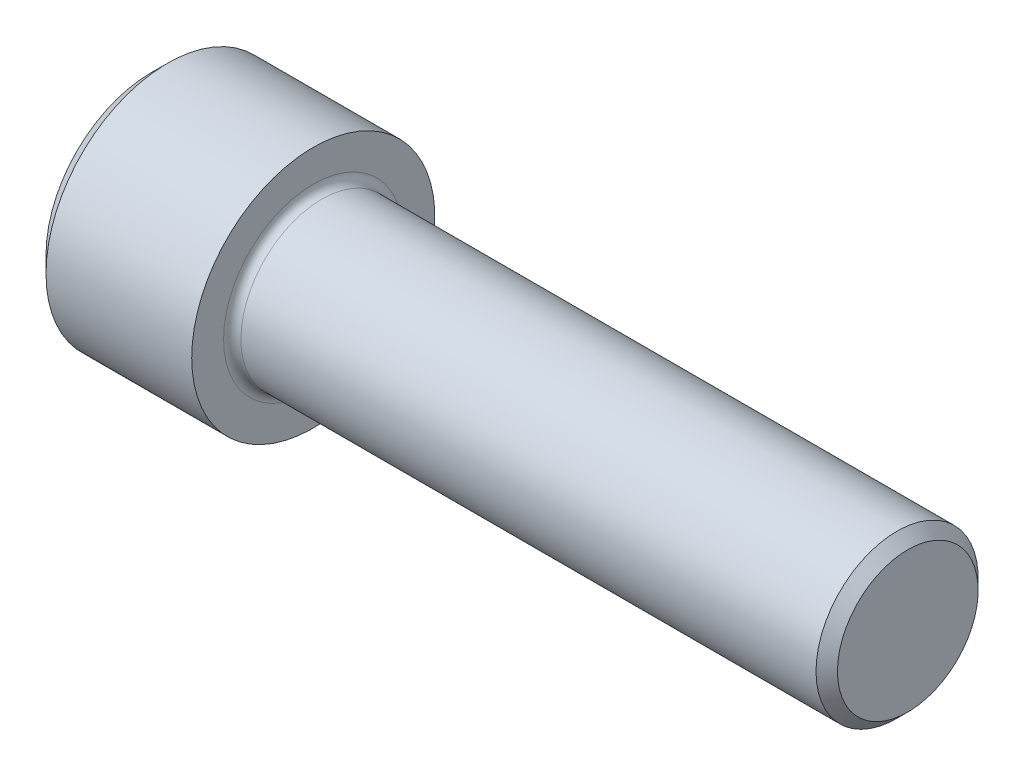
ISO-10303-21;
HEADER;
FILE_DESCRIPTION(('STEP AP214'),'2;1');
FILE_NAME('part.step','',(''),(''),'','','');
FILE_SCHEMA(('AUTOMOTIVE_DESIGN { 1 0 10303 214 1 1 1 1 }'));
ENDSEC;
DATA;
#1=APPLICATION_CONTEXT('core data for automotive mechanical design processes');
#2=APPLICATION_PROTOCOL_DEFINITION('international standard','automotive_design',2000,#1);
#3=PRODUCT_CONTEXT('',#1,'mechanical');
#4=PRODUCT('Part','Part','',(#3));
#5=PRODUCT_RELATED_PRODUCT_CATEGORY('part','',(#4));
#6=PRODUCT_DEFINITION_FORMATION('','',#4);
#7=PRODUCT_DEFINITION_CONTEXT('part definition',#1,'design');
#8=PRODUCT_DEFINITION('design','',#6,#7);
#9=PRODUCT_DEFINITION_SHAPE('','',#8);
#10=(LENGTH_UNIT() NAMED_UNIT(*) SI_UNIT(.MILLI.,.METRE.));
#11=(NAMED_UNIT(*) PLANE_ANGLE_UNIT() SI_UNIT($,.RADIAN.));
#12=(NAMED_UNIT(*) SI_UNIT($,.STERADIAN.) SOLID_ANGLE_UNIT());
#13=UNCERTAINTY_MEASURE_WITH_UNIT(LENGTH_MEASURE(1.E-05),#10,'distance_accuracy_value','');
#14=(GEOMETRIC_REPRESENTATION_CONTEXT(3) GLOBAL_UNCERTAINTY_ASSIGNED_CONTEXT((#13)) GLOBAL_UNIT_ASSIGNED_CONTEXT((#10,
#11,#12)) REPRESENTATION_CONTEXT('',''));
#15=CARTESIAN_POINT('',(0.,0.,0.));
#16=DIRECTION('',(0.,0.,1.));
#17=DIRECTION('',(1.,0.,0.));
#18=AXIS2_PLACEMENT_3D('',#15,#16,#17);
#19=CARTESIAN_POINT('',(0.,0.,0.));
#20=DIRECTION('',(-1.,0.,0.));
#21=DIRECTION('',(0.,0.,1.));
#22=AXIS2_PLACEMENT_3D('',#19,#20,#21);
#23=PLANE('',#22);
#24=DIRECTION('',(0.,-0.499999999999999,0.866025403784439));
#25=VECTOR('',#24,1.);
#26=CARTESIAN_POINT('',(0.,4.58271776169266,0.));
#27=LINE('',#26,#25);
#28=CARTESIAN_POINT('',(0.,4.58271776169266,0.));
#29=VERTEX_POINT('',#28);
#30=CARTESIAN_POINT('',(0.,2.29135888084634,3.96874999999999));
#31=VERTEX_POINT('',#30);
#32=EDGE_CURVE('E266',#29,#31,#27,.T.);
#33=ORIENTED_EDGE('',*,*,#32,.T.);
#34=DIRECTION('',(0.,1.,0.));
#35=VECTOR('',#34,1.);
#36=CARTESIAN_POINT('',(0.,-2.29135888084632,3.96875));
#37=LINE('',#36,#35);
#38=CARTESIAN_POINT('',(0.,-2.29135888084632,3.96875));
#39=VERTEX_POINT('',#38);
#40=EDGE_CURVE('E126',#39,#31,#37,.T.);
#41=ORIENTED_EDGE('',*,*,#40,.F.);
#42=DIRECTION('',(0.,-0.500000000000001,-0.866025403784438));
#43=VECTOR('',#42,1.);
#44=CARTESIAN_POINT('',(0.,-2.29135888084632,3.96875));
#45=LINE('',#44,#43);
#46=CARTESIAN_POINT('',(0.,-4.58271776169265,0.));
#47=VERTEX_POINT('',#46);
#48=EDGE_CURVE('E269',#39,#47,#45,.T.);
#49=ORIENTED_EDGE('',*,*,#48,.T.);
#50=DIRECTION('',(0.,0.499999999999998,-0.86602540378444));
#51=VECTOR('',#50,1.);
#52=CARTESIAN_POINT('',(0.,-4.58271776169265,0.));
#53=LINE('',#52,#51);
#54=CARTESIAN_POINT('',(0.,-2.29135888084633,-3.96875));
#55=VERTEX_POINT('',#54);
#56=EDGE_CURVE('E272',#47,#55,#53,.T.);
#57=ORIENTED_EDGE('',*,*,#56,.T.);
#58=DIRECTION('',(0.,-1.,0.));
#59=VECTOR('',#58,1.);
#60=CARTESIAN_POINT('',(0.,2.29135888084633,-3.96875));
#61=LINE('',#60,#59);
#62=CARTESIAN_POINT('',(0.,2.29135888084633,-3.96875));
#63=VERTEX_POINT('',#62);
#64=EDGE_CURVE('E275',#63,#55,#61,.T.);
#65=ORIENTED_EDGE('',*,*,#64,.F.);
#66=DIRECTION('',(0.,-0.500000000000001,-0.866025403784438));
#67=VECTOR('',#66,1.);
#68=CARTESIAN_POINT('',(0.,4.58271776169266,0.));
#69=LINE('',#68,#67);
#70=EDGE_CURVE('E121',#29,#63,#69,.T.);
#71=ORIENTED_EDGE('',*,*,#70,.F.);
#72=EDGE_LOOP('',(#33,#41,#49,#57,#65,#71));
#73=FACE_BOUND('',#72,.T.);
#74=CARTESIAN_POINT('',(0.,0.,0.));
#75=DIRECTION('',(-1.,0.,0.));
#76=DIRECTION('',(0.,0.,1.));
#77=AXIS2_PLACEMENT_3D('',#74,#75,#76);
#78=CIRCLE('',#77,6.17855);
#79=CARTESIAN_POINT('',(0.,0.,6.17855));
#80=VERTEX_POINT('',#79);
#81=EDGE_CURVE('E150',#80,#80,#78,.T.);
#82=ORIENTED_EDGE('',*,*,#81,.T.);
#83=EDGE_LOOP('',(#82));
#84=FACE_BOUND('',#83,.T.);
#85=ADVANCED_FACE('F34',(#73,#84),#23,.T.);
#86=CARTESIAN_POINT('',(0.,0.,0.));
#87=DIRECTION('',(1.,0.,0.));
#88=DIRECTION('',(0.,0.,-1.));
#89=AXIS2_PLACEMENT_3D('',#86,#87,#88);
#90=CONICAL_SURFACE('',#89,6.17855,0.785398163397447);
#91=CARTESIAN_POINT('',(0.965199999999999,0.,0.));
#92=DIRECTION('',(-1.,0.,0.));
#93=DIRECTION('',(0.,0.,1.));
#94=AXIS2_PLACEMENT_3D('',#91,#92,#93);
#95=CIRCLE('',#94,7.14375);
#96=CARTESIAN_POINT('',(0.965199999999999,0.,7.14375));
#97=VERTEX_POINT('',#96);
#98=EDGE_CURVE('E147',#97,#97,#95,.T.);
#99=ORIENTED_EDGE('',*,*,#98,.T.);
#100=EDGE_LOOP('',(#99));
#101=FACE_BOUND('',#100,.T.);
#102=ORIENTED_EDGE('',*,*,#81,.F.);
#103=EDGE_LOOP('',(#102));
#104=FACE_BOUND('',#103,.T.);
#105=ADVANCED_FACE('F171',(#101,#104),#90,.T.);
#106=CARTESIAN_POINT('',(-31.75,0.,0.));
#107=DIRECTION('',(-1.,0.,0.));
#108=DIRECTION('',(0.,0.,1.));
#109=AXIS2_PLACEMENT_3D('',#106,#107,#108);
#110=CYLINDRICAL_SURFACE('',#109,7.14375);
#111=CARTESIAN_POINT('',(9.525,0.,0.));
#112=DIRECTION('',(-1.,0.,0.));
#113=DIRECTION('',(0.,0.,1.));
#114=AXIS2_PLACEMENT_3D('',#111,#112,#113);
#115=CIRCLE('',#114,7.14375);
#116=CARTESIAN_POINT('',(9.525,0.,7.14375));
#117=VERTEX_POINT('',#116);
#118=EDGE_CURVE('E144',#117,#117,#115,.T.);
#119=ORIENTED_EDGE('',*,*,#118,.T.);
#120=EDGE_LOOP('',(#119));
#121=FACE_BOUND('',#120,.T.);
#122=ORIENTED_EDGE('',*,*,#98,.F.);
#123=EDGE_LOOP('',(#122));
#124=FACE_BOUND('',#123,.T.);
#125=ADVANCED_FACE('F176',(#121,#124),#110,.T.);
#126=CARTESIAN_POINT('',(9.525,7.14375,0.));
#127=DIRECTION('',(1.,0.,0.));
#128=DIRECTION('',(0.,0.,-1.));
#129=AXIS2_PLACEMENT_3D('',#126,#127,#128);
#130=PLANE('',#129);
#131=CARTESIAN_POINT('',(9.525,0.,0.));
#132=DIRECTION('',(1.,0.,0.));
#133=DIRECTION('',(0.,0.,-1.));
#134=AXIS2_PLACEMENT_3D('',#131,#132,#133);
#135=CIRCLE('',#134,5.27049999999996);
#136=CARTESIAN_POINT('',(9.525,0.,-5.27049999999996));
#137=VERTEX_POINT('',#136);
#138=EDGE_CURVE('E42',#137,#137,#135,.F.);
#139=ORIENTED_EDGE('',*,*,#138,.T.);
#140=EDGE_LOOP('',(#139));
#141=FACE_BOUND('',#140,.T.);
#142=ORIENTED_EDGE('',*,*,#118,.F.);
#143=EDGE_LOOP('',(#142));
#144=FACE_BOUND('',#143,.T.);
#145=ADVANCED_FACE('F155',(#141,#144),#130,.T.);
#146=CARTESIAN_POINT('',(-31.75,0.,0.));
#147=DIRECTION('',(-1.,0.,0.));
#148=DIRECTION('',(0.,0.,1.));
#149=AXIS2_PLACEMENT_3D('',#146,#147,#148);
#150=CYLINDRICAL_SURFACE('',#149,4.76249999999996);
#151=CARTESIAN_POINT('',(10.033,0.,0.));
#152=DIRECTION('',(1.,0.,0.));
#153=DIRECTION('',(0.,0.,-1.));
#154=AXIS2_PLACEMENT_3D('',#151,#152,#153);
#155=CIRCLE('',#154,4.76249999999996);
#156=CARTESIAN_POINT('',(10.033,0.,-4.76249999999996));
#157=VERTEX_POINT('',#156);
#158=EDGE_CURVE('E11',#157,#157,#155,.T.);
#159=ORIENTED_EDGE('',*,*,#158,.T.);
#160=EDGE_LOOP('',(#159));
#161=FACE_BOUND('',#160,.T.);
#162=CARTESIAN_POINT('',(43.8200799999999,0.,0.));
#163=DIRECTION('',(-1.,0.,0.));
#164=DIRECTION('',(0.,0.,1.));
#165=AXIS2_PLACEMENT_3D('',#162,#163,#164);
#166=CIRCLE('',#165,4.76249999999992);
#167=CARTESIAN_POINT('',(43.8200799999999,0.,4.76249999999992));
#168=VERTEX_POINT('',#167);
#169=EDGE_CURVE('E141',#168,#168,#166,.T.);
#170=ORIENTED_EDGE('',*,*,#169,.T.);
#171=EDGE_LOOP('',(#170));
#172=FACE_BOUND('',#171,.T.);
#173=ADVANCED_FACE('F186',(#161,#172),#150,.T.);
#174=CARTESIAN_POINT('',(44.45,0.,0.));
#175=DIRECTION('',(-1.,0.,0.));
#176=DIRECTION('',(0.,0.,1.));
#177=AXIS2_PLACEMENT_3D('',#174,#175,#176);
#178=CONICAL_SURFACE('',#177,4.13258,0.785398163397337);
#179=ORIENTED_EDGE('',*,*,#169,.F.);
#180=EDGE_LOOP('',(#179));
#181=FACE_BOUND('',#180,.T.);
#182=CARTESIAN_POINT('',(44.45,0.,0.));
#183=DIRECTION('',(-1.,0.,0.));
#184=DIRECTION('',(0.,0.,1.));
#185=AXIS2_PLACEMENT_3D('',#182,#183,#184);
#186=CIRCLE('',#185,4.13258);
#187=CARTESIAN_POINT('',(44.45,0.,4.13258));
#188=VERTEX_POINT('',#187);
#189=EDGE_CURVE('E137',#188,#188,#186,.T.);
#190=ORIENTED_EDGE('',*,*,#189,.T.);
#191=EDGE_LOOP('',(#190));
#192=FACE_BOUND('',#191,.T.);
#193=ADVANCED_FACE('F166',(#181,#192),#178,.T.);
#194=CARTESIAN_POINT('',(44.45,4.13258,0.));
#195=DIRECTION('',(1.,0.,0.));
#196=DIRECTION('',(0.,0.,-1.));
#197=AXIS2_PLACEMENT_3D('',#194,#195,#196);
#198=PLANE('',#197);
#199=ORIENTED_EDGE('',*,*,#189,.F.);
#200=EDGE_LOOP('',(#199));
#201=FACE_BOUND('',#200,.T.);
#202=ADVANCED_FACE('F159',(#201),#198,.T.);
#203=CARTESIAN_POINT('',(10.033,0.,0.));
#204=DIRECTION('',(1.,0.,0.));
#205=DIRECTION('',(0.,0.,-1.));
#206=AXIS2_PLACEMENT_3D('',#203,#204,#205);
#207=TOROIDAL_SURFACE('',#206,5.27049999999996,0.508);
#208=ORIENTED_EDGE('',*,*,#158,.F.);
#209=EDGE_LOOP('',(#208));
#210=FACE_BOUND('',#209,.T.);
#211=ORIENTED_EDGE('',*,*,#138,.F.);
#212=EDGE_LOOP('',(#211));
#213=FACE_BOUND('',#212,.T.);
#214=ADVANCED_FACE('F36',(#210,#213),#207,.F.);
#215=CARTESIAN_POINT('',(4.6228,4.58271776169266,0.));
#216=DIRECTION('',(0.,-0.866025403784439,-0.499999999999999));
#217=DIRECTION('',(0.,0.499999999999999,-0.866025403784439));
#218=AXIS2_PLACEMENT_3D('',#215,#216,#217);
#219=PLANE('',#218);
#220=ORIENTED_EDGE('',*,*,#32,.F.);
#221=DIRECTION('',(-1.,0.,0.));
#222=VECTOR('',#221,1.);
#223=CARTESIAN_POINT('',(4.6228,4.58271776169266,0.));
#224=LINE('',#223,#222);
#225=CARTESIAN_POINT('',(4.6228,4.58271776169266,0.));
#226=VERTEX_POINT('',#225);
#227=EDGE_CURVE('E265',#226,#29,#224,.T.);
#228=ORIENTED_EDGE('',*,*,#227,.F.);
#229=DIRECTION('',(0.,-0.499999999999999,0.866025403784439));
#230=VECTOR('',#229,1.);
#231=CARTESIAN_POINT('',(4.6228,4.58271776169266,0.));
#232=LINE('',#231,#230);
#233=CARTESIAN_POINT('',(4.6228,3.43703832126949,1.984375));
#234=VERTEX_POINT('',#233);
#235=EDGE_CURVE('E49',#226,#234,#232,.T.);
#236=ORIENTED_EDGE('',*,*,#235,.T.);
#237=CARTESIAN_POINT('',(4.6228,2.29135888084634,3.96874999999999));
#238=VERTEX_POINT('',#237);
#239=EDGE_CURVE('E107',#234,#238,#232,.T.);
#240=ORIENTED_EDGE('',*,*,#239,.T.);
#241=DIRECTION('',(-1.,0.,0.));
#242=VECTOR('',#241,1.);
#243=CARTESIAN_POINT('',(4.6228,2.29135888084634,3.96874999999999));
#244=LINE('',#243,#242);
#245=EDGE_CURVE('E119',#238,#31,#244,.T.);
#246=ORIENTED_EDGE('',*,*,#245,.T.);
#247=EDGE_LOOP('',(#220,#228,#236,#240,#246));
#248=FACE_BOUND('',#247,.T.);
#249=ADVANCED_FACE('F118',(#248),#219,.T.);
#250=CARTESIAN_POINT('',(4.6228,-2.29135888084632,3.96875));
#251=DIRECTION('',(0.,0.,1.));
#252=DIRECTION('',(0.,-1.,0.));
#253=AXIS2_PLACEMENT_3D('',#250,#251,#252);
#254=PLANE('',#253);
#255=ORIENTED_EDGE('',*,*,#40,.T.);
#256=ORIENTED_EDGE('',*,*,#245,.F.);
#257=DIRECTION('',(0.,1.,0.));
#258=VECTOR('',#257,1.);
#259=CARTESIAN_POINT('',(4.6228,-2.29135888084632,3.96875));
#260=LINE('',#259,#258);
#261=CARTESIAN_POINT('',(4.6228,0.,3.96875));
#262=VERTEX_POINT('',#261);
#263=EDGE_CURVE('E105',#262,#238,#260,.T.);
#264=ORIENTED_EDGE('',*,*,#263,.F.);
#265=CARTESIAN_POINT('',(4.6228,-2.29135888084632,3.96875));
#266=VERTEX_POINT('',#265);
#267=EDGE_CURVE('E115',#266,#262,#260,.T.);
#268=ORIENTED_EDGE('',*,*,#267,.F.);
#269=DIRECTION('',(-1.,0.,0.));
#270=VECTOR('',#269,1.);
#271=CARTESIAN_POINT('',(4.6228,-2.29135888084632,3.96875));
#272=LINE('',#271,#270);
#273=EDGE_CURVE('E128',#266,#39,#272,.T.);
#274=ORIENTED_EDGE('',*,*,#273,.T.);
#275=EDGE_LOOP('',(#255,#256,#264,#268,#274));
#276=FACE_BOUND('',#275,.T.);
#277=ADVANCED_FACE('F123',(#276),#254,.F.);
#278=CARTESIAN_POINT('',(4.6228,-2.29135888084632,3.96875));
#279=DIRECTION('',(0.,0.866025403784438,-0.500000000000001));
#280=DIRECTION('',(0.,0.500000000000001,0.866025403784438));
#281=AXIS2_PLACEMENT_3D('',#278,#279,#280);
#282=PLANE('',#281);
#283=ORIENTED_EDGE('',*,*,#48,.F.);
#284=ORIENTED_EDGE('',*,*,#273,.F.);
#285=DIRECTION('',(0.,-0.500000000000001,-0.866025403784438));
#286=VECTOR('',#285,1.);
#287=CARTESIAN_POINT('',(4.6228,-2.29135888084632,3.96875));
#288=LINE('',#287,#286);
#289=CARTESIAN_POINT('',(4.6228,-3.43703832126948,1.984375));
#290=VERTEX_POINT('',#289);
#291=EDGE_CURVE('E246',#266,#290,#288,.T.);
#292=ORIENTED_EDGE('',*,*,#291,.T.);
#293=CARTESIAN_POINT('',(4.6228,-4.58271776169265,0.));
#294=VERTEX_POINT('',#293);
#295=EDGE_CURVE('E248',#290,#294,#288,.T.);
#296=ORIENTED_EDGE('',*,*,#295,.T.);
#297=DIRECTION('',(-1.,0.,0.));
#298=VECTOR('',#297,1.);
#299=CARTESIAN_POINT('',(4.6228,-4.58271776169265,0.));
#300=LINE('',#299,#298);
#301=EDGE_CURVE('E133',#294,#47,#300,.T.);
#302=ORIENTED_EDGE('',*,*,#301,.T.);
#303=EDGE_LOOP('',(#283,#284,#292,#296,#302));
#304=FACE_BOUND('',#303,.T.);
#305=ADVANCED_FACE('F198',(#304),#282,.T.);
#306=CARTESIAN_POINT('',(4.6228,-4.58271776169265,0.));
#307=DIRECTION('',(0.,0.86602540378444,0.499999999999998));
#308=DIRECTION('',(0.,-0.499999999999998,0.86602540378444));
#309=AXIS2_PLACEMENT_3D('',#306,#307,#308);
#310=PLANE('',#309);
#311=ORIENTED_EDGE('',*,*,#56,.F.);
#312=ORIENTED_EDGE('',*,*,#301,.F.);
#313=DIRECTION('',(0.,0.499999999999998,-0.86602540378444));
#314=VECTOR('',#313,1.);
#315=CARTESIAN_POINT('',(4.6228,-4.58271776169265,0.));
#316=LINE('',#315,#314);
#317=CARTESIAN_POINT('',(4.6228,-3.43703832126949,-1.98437499999999));
#318=VERTEX_POINT('',#317);
#319=EDGE_CURVE('E251',#294,#318,#316,.T.);
#320=ORIENTED_EDGE('',*,*,#319,.T.);
#321=CARTESIAN_POINT('',(4.6228,-2.29135888084633,-3.96875));
#322=VERTEX_POINT('',#321);
#323=EDGE_CURVE('E255',#318,#322,#316,.T.);
#324=ORIENTED_EDGE('',*,*,#323,.T.);
#325=DIRECTION('',(-1.,0.,0.));
#326=VECTOR('',#325,1.);
#327=CARTESIAN_POINT('',(4.6228,-2.29135888084633,-3.96875));
#328=LINE('',#327,#326);
#329=EDGE_CURVE('E284',#322,#55,#328,.T.);
#330=ORIENTED_EDGE('',*,*,#329,.T.);
#331=EDGE_LOOP('',(#311,#312,#320,#324,#330));
#332=FACE_BOUND('',#331,.T.);
#333=ADVANCED_FACE('F201',(#332),#310,.T.);
#334=CARTESIAN_POINT('',(4.6228,2.29135888084633,-3.96875));
#335=DIRECTION('',(0.,0.,-1.));
#336=DIRECTION('',(0.,1.,0.));
#337=AXIS2_PLACEMENT_3D('',#334,#335,#336);
#338=PLANE('',#337);
#339=ORIENTED_EDGE('',*,*,#64,.T.);
#340=ORIENTED_EDGE('',*,*,#329,.F.);
#341=DIRECTION('',(0.,-1.,0.));
#342=VECTOR('',#341,1.);
#343=CARTESIAN_POINT('',(4.6228,2.29135888084633,-3.96875));
#344=LINE('',#343,#342);
#345=CARTESIAN_POINT('',(4.6228,0.,-3.96875));
#346=VERTEX_POINT('',#345);
#347=EDGE_CURVE('E259',#346,#322,#344,.T.);
#348=ORIENTED_EDGE('',*,*,#347,.F.);
#349=CARTESIAN_POINT('',(4.6228,2.29135888084633,-3.96875));
#350=VERTEX_POINT('',#349);
#351=EDGE_CURVE('E260',#350,#346,#344,.T.);
#352=ORIENTED_EDGE('',*,*,#351,.F.);
#353=DIRECTION('',(-1.,0.,0.));
#354=VECTOR('',#353,1.);
#355=CARTESIAN_POINT('',(4.6228,2.29135888084633,-3.96875));
#356=LINE('',#355,#354);
#357=EDGE_CURVE('E281',#350,#63,#356,.T.);
#358=ORIENTED_EDGE('',*,*,#357,.T.);
#359=EDGE_LOOP('',(#339,#340,#348,#352,#358));
#360=FACE_BOUND('',#359,.T.);
#361=ADVANCED_FACE('F205',(#360),#338,.F.);
#362=CARTESIAN_POINT('',(4.6228,4.58271776169266,0.));
#363=DIRECTION('',(0.,0.866025403784438,-0.500000000000001));
#364=DIRECTION('',(0.,0.500000000000001,0.866025403784438));
#365=AXIS2_PLACEMENT_3D('',#362,#363,#364);
#366=PLANE('',#365);
#367=ORIENTED_EDGE('',*,*,#70,.T.);
#368=ORIENTED_EDGE('',*,*,#357,.F.);
#369=DIRECTION('',(0.,-0.500000000000001,-0.866025403784438));
#370=VECTOR('',#369,1.);
#371=CARTESIAN_POINT('',(4.6228,4.58271776169266,0.));
#372=LINE('',#371,#370);
#373=CARTESIAN_POINT('',(4.6228,3.43703832126949,-1.98437500000001));
#374=VERTEX_POINT('',#373);
#375=EDGE_CURVE('E263',#374,#350,#372,.T.);
#376=ORIENTED_EDGE('',*,*,#375,.F.);
#377=EDGE_CURVE('E237',#226,#374,#372,.T.);
#378=ORIENTED_EDGE('',*,*,#377,.F.);
#379=ORIENTED_EDGE('',*,*,#227,.T.);
#380=EDGE_LOOP('',(#367,#368,#376,#378,#379));
#381=FACE_BOUND('',#380,.T.);
#382=ADVANCED_FACE('F209',(#381),#366,.F.);
#383=CARTESIAN_POINT('',(4.6228,2.29135888084634,3.96874999999999));
#384=DIRECTION('',(-1.,0.,0.));
#385=DIRECTION('',(0.,0.,1.));
#386=AXIS2_PLACEMENT_3D('',#383,#384,#385);
#387=PLANE('',#386);
#388=CARTESIAN_POINT('',(4.6228,0.,0.));
#389=DIRECTION('',(-1.,0.,0.));
#390=DIRECTION('',(0.,0.,1.));
#391=AXIS2_PLACEMENT_3D('',#388,#389,#390);
#392=CIRCLE('',#391,3.96875);
#393=EDGE_CURVE('E127',#290,#262,#392,.T.);
#394=ORIENTED_EDGE('',*,*,#393,.F.);
#395=ORIENTED_EDGE('',*,*,#291,.F.);
#396=ORIENTED_EDGE('',*,*,#267,.T.);
#397=EDGE_LOOP('',(#394,#395,#396));
#398=FACE_BOUND('',#397,.T.);
#399=ADVANCED_FACE('F213',(#398),#387,.T.);
#400=EDGE_CURVE('E131',#318,#290,#392,.T.);
#401=ORIENTED_EDGE('',*,*,#400,.F.);
#402=ORIENTED_EDGE('',*,*,#319,.F.);
#403=ORIENTED_EDGE('',*,*,#295,.F.);
#404=EDGE_LOOP('',(#401,#402,#403));
#405=FACE_BOUND('',#404,.T.);
#406=ADVANCED_FACE('F216',(#405),#387,.T.);
#407=EDGE_CURVE('E290',#346,#318,#392,.T.);
#408=ORIENTED_EDGE('',*,*,#407,.F.);
#409=ORIENTED_EDGE('',*,*,#347,.T.);
#410=ORIENTED_EDGE('',*,*,#323,.F.);
#411=EDGE_LOOP('',(#408,#409,#410));
#412=FACE_BOUND('',#411,.T.);
#413=ADVANCED_FACE('F221',(#412),#387,.T.);
#414=EDGE_CURVE('E240',#374,#346,#392,.T.);
#415=ORIENTED_EDGE('',*,*,#414,.F.);
#416=ORIENTED_EDGE('',*,*,#375,.T.);
#417=ORIENTED_EDGE('',*,*,#351,.T.);
#418=EDGE_LOOP('',(#415,#416,#417));
#419=FACE_BOUND('',#418,.T.);
#420=ADVANCED_FACE('F228',(#419),#387,.T.);
#421=EDGE_CURVE('E138',#234,#374,#392,.T.);
#422=ORIENTED_EDGE('',*,*,#421,.F.);
#423=ORIENTED_EDGE('',*,*,#235,.F.);
#424=ORIENTED_EDGE('',*,*,#377,.T.);
#425=EDGE_LOOP('',(#422,#423,#424));
#426=FACE_BOUND('',#425,.T.);
#427=ADVANCED_FACE('F224',(#426),#387,.T.);
#428=EDGE_CURVE('E110',#262,#234,#392,.T.);
#429=ORIENTED_EDGE('',*,*,#428,.F.);
#430=ORIENTED_EDGE('',*,*,#263,.T.);
#431=ORIENTED_EDGE('',*,*,#239,.F.);
#432=EDGE_LOOP('',(#429,#430,#431));
#433=FACE_BOUND('',#432,.T.);
#434=ADVANCED_FACE('F106',(#433),#387,.T.);
#435=CARTESIAN_POINT('',(4.6228,0.,0.));
#436=DIRECTION('',(-1.,0.,0.));
#437=DIRECTION('',(0.,0.,1.));
#438=AXIS2_PLACEMENT_3D('',#435,#436,#437);
#439=CONICAL_SURFACE('',#438,3.96875,1.04719755119659);
#440=CARTESIAN_POINT('',(6.91415888084634,0.,0.));
#441=VERTEX_POINT('',#440);
#442=VERTEX_LOOP('',#441);
#443=FACE_BOUND('',#442,.T.);
#444=ORIENTED_EDGE('',*,*,#428,.T.);
#445=ORIENTED_EDGE('',*,*,#421,.T.);
#446=ORIENTED_EDGE('',*,*,#414,.T.);
#447=ORIENTED_EDGE('',*,*,#407,.T.);
#448=ORIENTED_EDGE('',*,*,#400,.T.);
#449=ORIENTED_EDGE('',*,*,#393,.T.);
#450=EDGE_LOOP('',(#444,#445,#446,#447,#448,#449));
#451=FACE_BOUND('',#450,.T.);
#452=ADVANCED_FACE('F193',(#443,#451),#439,.F.);
#453=CLOSED_SHELL('',(#85,#105,#125,#145,#173,#193,#202,#214,#249,#277,#305,#333,#361,#382,#399,
#406,#413,#420,#427,#434,#452));
#454=MANIFOLD_SOLID_BREP('B2',#453);
#455=ADVANCED_BREP_SHAPE_REPRESENTATION('',(#18,#454),#14);
#456=SHAPE_DEFINITION_REPRESENTATION(#9,#455);
ENDSEC;
END-ISO-10303-21;
